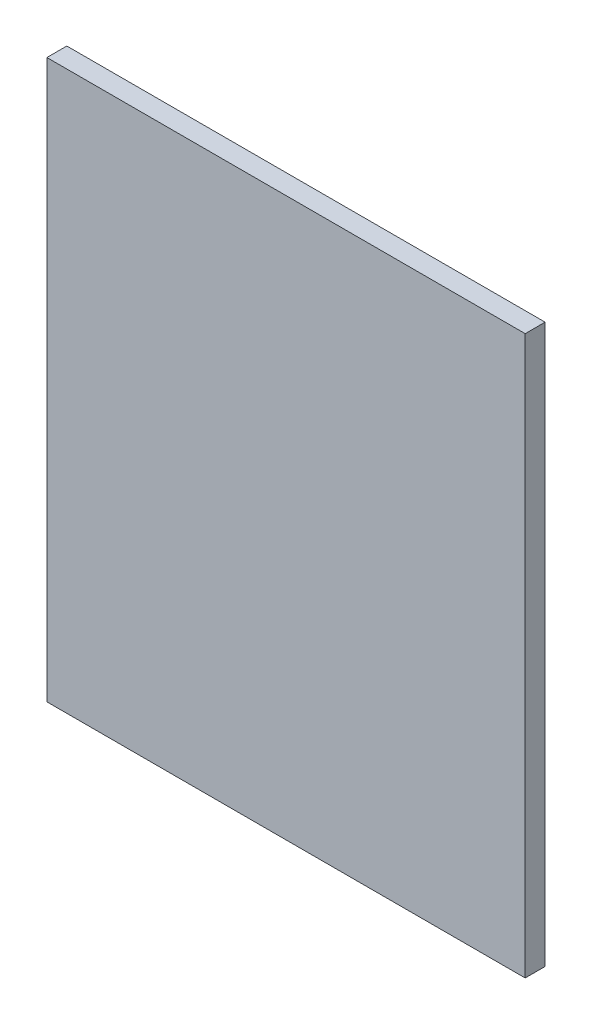
ISO-10303-21;
HEADER;
FILE_DESCRIPTION(('STEP AP214'),'2;1');
FILE_NAME('part.step','',(''),(''),'','','');
FILE_SCHEMA(('AUTOMOTIVE_DESIGN { 1 0 10303 214 1 1 1 1 }'));
ENDSEC;
DATA;
#1=APPLICATION_CONTEXT('core data for automotive mechanical design processes');
#2=APPLICATION_PROTOCOL_DEFINITION('international standard','automotive_design',2000,#1);
#3=PRODUCT_CONTEXT('',#1,'mechanical');
#4=PRODUCT('Part','Part','',(#3));
#5=PRODUCT_RELATED_PRODUCT_CATEGORY('part','',(#4));
#6=PRODUCT_DEFINITION_FORMATION('','',#4);
#7=PRODUCT_DEFINITION_CONTEXT('part definition',#1,'design');
#8=PRODUCT_DEFINITION('design','',#6,#7);
#9=PRODUCT_DEFINITION_SHAPE('','',#8);
#10=(LENGTH_UNIT() NAMED_UNIT(*) SI_UNIT(.MILLI.,.METRE.));
#11=(NAMED_UNIT(*) PLANE_ANGLE_UNIT() SI_UNIT($,.RADIAN.));
#12=(NAMED_UNIT(*) SI_UNIT($,.STERADIAN.) SOLID_ANGLE_UNIT());
#13=UNCERTAINTY_MEASURE_WITH_UNIT(LENGTH_MEASURE(1.E-05),#10,'distance_accuracy_value','');
#14=(GEOMETRIC_REPRESENTATION_CONTEXT(3) GLOBAL_UNCERTAINTY_ASSIGNED_CONTEXT((#13)) GLOBAL_UNIT_ASSIGNED_CONTEXT((#10,
#11,#12)) REPRESENTATION_CONTEXT('',''));
#15=CARTESIAN_POINT('',(0.,0.,0.));
#16=DIRECTION('',(0.,0.,1.));
#17=DIRECTION('',(1.,0.,0.));
#18=AXIS2_PLACEMENT_3D('',#15,#16,#17);
#19=CARTESIAN_POINT('',(76.2,-88.9,6.35));
#20=DIRECTION('',(-1.,0.,0.));
#21=DIRECTION('',(0.,0.,1.));
#22=AXIS2_PLACEMENT_3D('',#19,#20,#21);
#23=PLANE('',#22);
#24=DIRECTION('',(0.,1.,0.));
#25=VECTOR('',#24,1.);
#26=CARTESIAN_POINT('',(76.2,-88.9,0.));
#27=LINE('',#26,#25);
#28=CARTESIAN_POINT('',(76.2,-88.9,0.));
#29=VERTEX_POINT('',#28);
#30=CARTESIAN_POINT('',(76.2,88.9,0.));
#31=VERTEX_POINT('',#30);
#32=EDGE_CURVE('E111',#29,#31,#27,.T.);
#33=ORIENTED_EDGE('',*,*,#32,.T.);
#34=DIRECTION('',(0.,0.,-1.));
#35=VECTOR('',#34,1.);
#36=CARTESIAN_POINT('',(76.2,88.9,6.35));
#37=LINE('',#36,#35);
#38=CARTESIAN_POINT('',(76.2,88.9,6.35));
#39=VERTEX_POINT('',#38);
#40=EDGE_CURVE('E11',#39,#31,#37,.T.);
#41=ORIENTED_EDGE('',*,*,#40,.F.);
#42=DIRECTION('',(0.,1.,0.));
#43=VECTOR('',#42,1.);
#44=CARTESIAN_POINT('',(76.2,-88.9,6.35));
#45=LINE('',#44,#43);
#46=CARTESIAN_POINT('',(76.2,-88.9,6.35));
#47=VERTEX_POINT('',#46);
#48=EDGE_CURVE('E95',#47,#39,#45,.T.);
#49=ORIENTED_EDGE('',*,*,#48,.F.);
#50=DIRECTION('',(0.,0.,-1.));
#51=VECTOR('',#50,1.);
#52=CARTESIAN_POINT('',(76.2,-88.9,6.35));
#53=LINE('',#52,#51);
#54=EDGE_CURVE('E107',#47,#29,#53,.T.);
#55=ORIENTED_EDGE('',*,*,#54,.T.);
#56=EDGE_LOOP('',(#33,#41,#49,#55));
#57=FACE_BOUND('',#56,.T.);
#58=ADVANCED_FACE('F43',(#57),#23,.F.);
#59=CARTESIAN_POINT('',(-76.2,88.9,6.35));
#60=DIRECTION('',(0.,-1.,0.));
#61=DIRECTION('',(0.,0.,-1.));
#62=AXIS2_PLACEMENT_3D('',#59,#60,#61);
#63=PLANE('',#62);
#64=DIRECTION('',(-1.,0.,0.));
#65=VECTOR('',#64,1.);
#66=CARTESIAN_POINT('',(-76.2,88.9,0.));
#67=LINE('',#66,#65);
#68=CARTESIAN_POINT('',(-76.2,88.9,0.));
#69=VERTEX_POINT('',#68);
#70=EDGE_CURVE('E100',#31,#69,#67,.T.);
#71=ORIENTED_EDGE('',*,*,#70,.T.);
#72=DIRECTION('',(0.,0.,-1.));
#73=VECTOR('',#72,1.);
#74=CARTESIAN_POINT('',(-76.2,88.9,6.35));
#75=LINE('',#74,#73);
#76=CARTESIAN_POINT('',(-76.2,88.9,6.35));
#77=VERTEX_POINT('',#76);
#78=EDGE_CURVE('E52',#77,#69,#75,.T.);
#79=ORIENTED_EDGE('',*,*,#78,.F.);
#80=DIRECTION('',(-1.,0.,0.));
#81=VECTOR('',#80,1.);
#82=CARTESIAN_POINT('',(-76.2,88.9,6.35));
#83=LINE('',#82,#81);
#84=EDGE_CURVE('E90',#39,#77,#83,.T.);
#85=ORIENTED_EDGE('',*,*,#84,.F.);
#86=ORIENTED_EDGE('',*,*,#40,.T.);
#87=EDGE_LOOP('',(#71,#79,#85,#86));
#88=FACE_BOUND('',#87,.T.);
#89=ADVANCED_FACE('F99',(#88),#63,.F.);
#90=CARTESIAN_POINT('',(-76.2,-88.9,6.35));
#91=DIRECTION('',(1.,0.,0.));
#92=DIRECTION('',(0.,0.,-1.));
#93=AXIS2_PLACEMENT_3D('',#90,#91,#92);
#94=PLANE('',#93);
#95=DIRECTION('',(0.,-1.,0.));
#96=VECTOR('',#95,1.);
#97=CARTESIAN_POINT('',(-76.2,-88.9,0.));
#98=LINE('',#97,#96);
#99=CARTESIAN_POINT('',(-76.2,-88.9,0.));
#100=VERTEX_POINT('',#99);
#101=EDGE_CURVE('E77',#69,#100,#98,.T.);
#102=ORIENTED_EDGE('',*,*,#101,.T.);
#103=DIRECTION('',(0.,0.,-1.));
#104=VECTOR('',#103,1.);
#105=CARTESIAN_POINT('',(-76.2,-88.9,6.35));
#106=LINE('',#105,#104);
#107=CARTESIAN_POINT('',(-76.2,-88.9,6.35));
#108=VERTEX_POINT('',#107);
#109=EDGE_CURVE('E102',#108,#100,#106,.T.);
#110=ORIENTED_EDGE('',*,*,#109,.F.);
#111=DIRECTION('',(0.,-1.,0.));
#112=VECTOR('',#111,1.);
#113=CARTESIAN_POINT('',(-76.2,-88.9,6.35));
#114=LINE('',#113,#112);
#115=EDGE_CURVE('E93',#77,#108,#114,.T.);
#116=ORIENTED_EDGE('',*,*,#115,.F.);
#117=ORIENTED_EDGE('',*,*,#78,.T.);
#118=EDGE_LOOP('',(#102,#110,#116,#117));
#119=FACE_BOUND('',#118,.T.);
#120=ADVANCED_FACE('F103',(#119),#94,.F.);
#121=CARTESIAN_POINT('',(-76.2,-88.9,6.35));
#122=DIRECTION('',(0.,1.,0.));
#123=DIRECTION('',(0.,0.,1.));
#124=AXIS2_PLACEMENT_3D('',#121,#122,#123);
#125=PLANE('',#124);
#126=DIRECTION('',(1.,0.,0.));
#127=VECTOR('',#126,1.);
#128=CARTESIAN_POINT('',(-76.2,-88.9,0.));
#129=LINE('',#128,#127);
#130=EDGE_CURVE('E83',#100,#29,#129,.T.);
#131=ORIENTED_EDGE('',*,*,#130,.T.);
#132=ORIENTED_EDGE('',*,*,#54,.F.);
#133=DIRECTION('',(1.,0.,0.));
#134=VECTOR('',#133,1.);
#135=CARTESIAN_POINT('',(-76.2,-88.9,6.35));
#136=LINE('',#135,#134);
#137=EDGE_CURVE('E60',#108,#47,#136,.T.);
#138=ORIENTED_EDGE('',*,*,#137,.F.);
#139=ORIENTED_EDGE('',*,*,#109,.T.);
#140=EDGE_LOOP('',(#131,#132,#138,#139));
#141=FACE_BOUND('',#140,.T.);
#142=ADVANCED_FACE('F124',(#141),#125,.F.);
#143=CARTESIAN_POINT('',(0.,0.,6.35));
#144=DIRECTION('',(0.,0.,-1.));
#145=DIRECTION('',(-1.,0.,0.));
#146=AXIS2_PLACEMENT_3D('',#143,#144,#145);
#147=PLANE('',#146);
#148=ORIENTED_EDGE('',*,*,#48,.T.);
#149=ORIENTED_EDGE('',*,*,#84,.T.);
#150=ORIENTED_EDGE('',*,*,#115,.T.);
#151=ORIENTED_EDGE('',*,*,#137,.T.);
#152=EDGE_LOOP('',(#148,#149,#150,#151));
#153=FACE_BOUND('',#152,.T.);
#154=ADVANCED_FACE('F91',(#153),#147,.F.);
#155=CARTESIAN_POINT('',(0.,0.,0.));
#156=DIRECTION('',(0.,0.,-1.));
#157=DIRECTION('',(-1.,0.,0.));
#158=AXIS2_PLACEMENT_3D('',#155,#156,#157);
#159=PLANE('',#158);
#160=ORIENTED_EDGE('',*,*,#32,.F.);
#161=ORIENTED_EDGE('',*,*,#130,.F.);
#162=ORIENTED_EDGE('',*,*,#101,.F.);
#163=ORIENTED_EDGE('',*,*,#70,.F.);
#164=EDGE_LOOP('',(#160,#161,#162,#163));
#165=FACE_BOUND('',#164,.T.);
#166=ADVANCED_FACE('F127',(#165),#159,.T.);
#167=CLOSED_SHELL('',(#58,#89,#120,#142,#154,#166));
#168=MANIFOLD_SOLID_BREP('B2',#167);
#169=ADVANCED_BREP_SHAPE_REPRESENTATION('',(#18,#168),#14);
#170=SHAPE_DEFINITION_REPRESENTATION(#9,#169);
ENDSEC;
END-ISO-10303-21;
